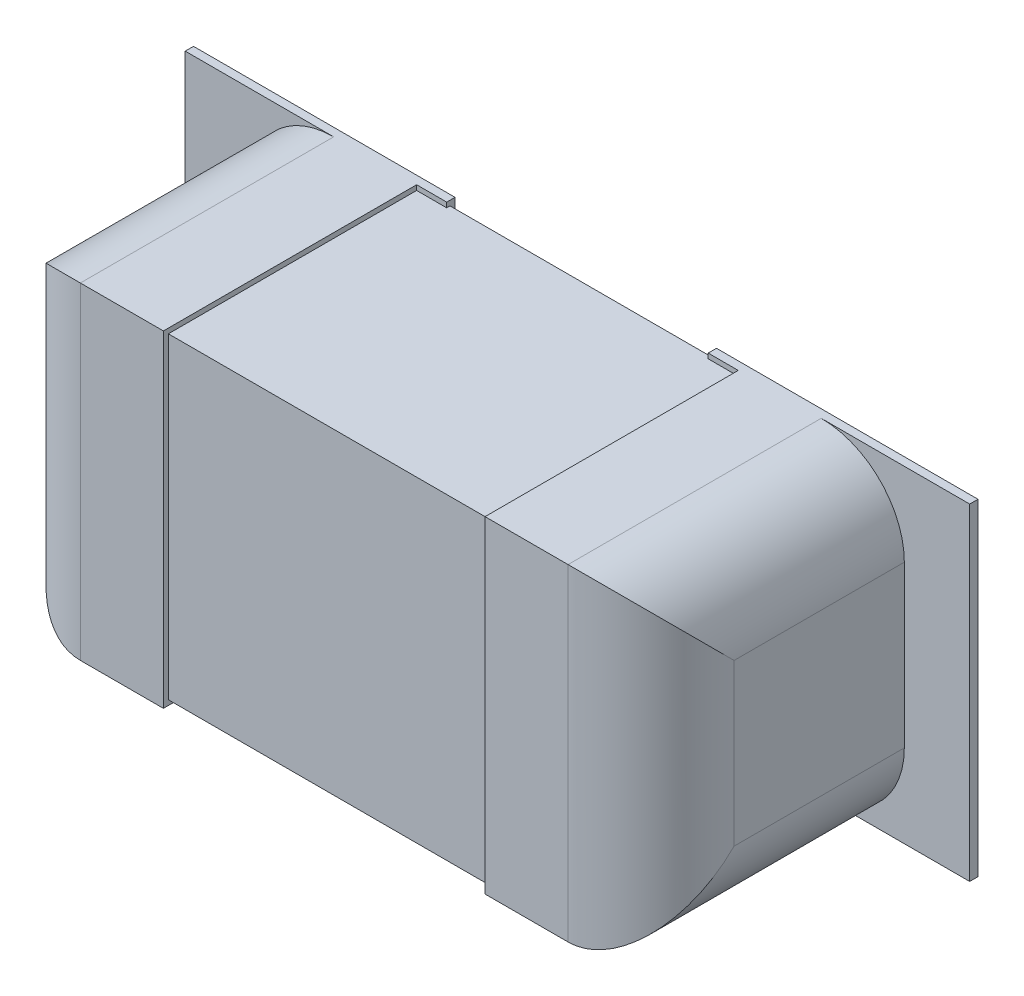
ISO-10303-21;
HEADER;
FILE_DESCRIPTION(('STEP AP214'),'2;1');
FILE_NAME('part.step','',(''),(''),'','','');
FILE_SCHEMA(('AUTOMOTIVE_DESIGN { 1 0 10303 214 1 1 1 1 }'));
ENDSEC;
DATA;
#1=APPLICATION_CONTEXT('core data for automotive mechanical design processes');
#2=APPLICATION_PROTOCOL_DEFINITION('international standard','automotive_design',2000,#1);
#3=PRODUCT_CONTEXT('',#1,'mechanical');
#4=PRODUCT('Part','Part','',(#3));
#5=PRODUCT_RELATED_PRODUCT_CATEGORY('part','',(#4));
#6=PRODUCT_DEFINITION_FORMATION('','',#4);
#7=PRODUCT_DEFINITION_CONTEXT('part definition',#1,'design');
#8=PRODUCT_DEFINITION('design','',#6,#7);
#9=PRODUCT_DEFINITION_SHAPE('','',#8);
#10=(LENGTH_UNIT() NAMED_UNIT(*) SI_UNIT(.MILLI.,.METRE.));
#11=(NAMED_UNIT(*) PLANE_ANGLE_UNIT() SI_UNIT($,.RADIAN.));
#12=(NAMED_UNIT(*) SI_UNIT($,.STERADIAN.) SOLID_ANGLE_UNIT());
#13=UNCERTAINTY_MEASURE_WITH_UNIT(LENGTH_MEASURE(1.E-05),#10,'distance_accuracy_value','');
#14=(GEOMETRIC_REPRESENTATION_CONTEXT(3) GLOBAL_UNCERTAINTY_ASSIGNED_CONTEXT((#13)) GLOBAL_UNIT_ASSIGNED_CONTEXT((#10,
#11,#12)) REPRESENTATION_CONTEXT('',''));
#15=CARTESIAN_POINT('',(0.,0.,0.));
#16=DIRECTION('',(0.,0.,1.));
#17=DIRECTION('',(1.,0.,0.));
#18=AXIS2_PLACEMENT_3D('',#15,#16,#17);
#19=CARTESIAN_POINT('',(0.500000000000032,-0.249999999999991,0.0762));
#20=DIRECTION('',(1.,0.,0.));
#21=DIRECTION('',(0.,0.,-1.));
#22=AXIS2_PLACEMENT_3D('',#19,#20,#21);
#23=PLANE('',#22);
#24=DIRECTION('',(0.,0.,-1.));
#25=VECTOR('',#24,1.);
#26=CARTESIAN_POINT('',(0.500000000000032,-0.122999999999991,0.478378306702738));
#27=LINE('',#26,#25);
#28=CARTESIAN_POINT('',(0.500000000000032,-0.122999999999991,0.0889));
#29=VERTEX_POINT('',#28);
#30=CARTESIAN_POINT('',(0.500000000000032,-0.122999999999991,0.34925));
#31=VERTEX_POINT('',#30);
#32=EDGE_CURVE('E337',#29,#31,#27,.F.);
#33=ORIENTED_EDGE('',*,*,#32,.F.);
#34=DIRECTION('',(0.,1.,0.));
#35=VECTOR('',#34,1.);
#36=CARTESIAN_POINT('',(0.500000000000032,0.,0.0889));
#37=LINE('',#36,#35);
#38=CARTESIAN_POINT('',(0.500000000000032,0.122999999999991,0.0889));
#39=VERTEX_POINT('',#38);
#40=EDGE_CURVE('E203',#39,#29,#37,.F.);
#41=ORIENTED_EDGE('',*,*,#40,.F.);
#42=DIRECTION('',(0.,0.,-1.));
#43=VECTOR('',#42,1.);
#44=CARTESIAN_POINT('',(0.500000000000032,0.122999999999991,0.478378306702738));
#45=LINE('',#44,#43);
#46=CARTESIAN_POINT('',(0.500000000000032,0.122999999999991,0.34925));
#47=VERTEX_POINT('',#46);
#48=EDGE_CURVE('E198',#47,#39,#45,.T.);
#49=ORIENTED_EDGE('',*,*,#48,.F.);
#50=DIRECTION('',(0.,1.,0.));
#51=VECTOR('',#50,1.);
#52=CARTESIAN_POINT('',(0.500000000000032,-0.252051106620578,0.34925));
#53=LINE('',#52,#51);
#54=EDGE_CURVE('E201',#31,#47,#53,.T.);
#55=ORIENTED_EDGE('',*,*,#54,.F.);
#56=EDGE_LOOP('',(#33,#41,#49,#55));
#57=FACE_BOUND('',#56,.T.);
#58=ADVANCED_FACE('F17',(#57),#23,.T.);
#59=CARTESIAN_POINT('',(-0.500000000000032,0.249999999999991,0.0762));
#60=DIRECTION('',(-1.,0.,0.));
#61=DIRECTION('',(0.,0.,1.));
#62=AXIS2_PLACEMENT_3D('',#59,#60,#61);
#63=PLANE('',#62);
#64=DIRECTION('',(0.,0.,-1.));
#65=VECTOR('',#64,1.);
#66=CARTESIAN_POINT('',(-0.500000000000032,0.122999999999991,0.478378306702738));
#67=LINE('',#66,#65);
#68=CARTESIAN_POINT('',(-0.500000000000032,0.122999999999991,0.0889));
#69=VERTEX_POINT('',#68);
#70=CARTESIAN_POINT('',(-0.500000000000032,0.122999999999991,0.34925));
#71=VERTEX_POINT('',#70);
#72=EDGE_CURVE('E322',#69,#71,#67,.F.);
#73=ORIENTED_EDGE('',*,*,#72,.F.);
#74=DIRECTION('',(0.,1.,0.));
#75=VECTOR('',#74,1.);
#76=CARTESIAN_POINT('',(-0.500000000000032,0.,0.0889));
#77=LINE('',#76,#75);
#78=CARTESIAN_POINT('',(-0.500000000000032,-0.122999999999991,0.0889));
#79=VERTEX_POINT('',#78);
#80=EDGE_CURVE('E326',#79,#69,#77,.T.);
#81=ORIENTED_EDGE('',*,*,#80,.F.);
#82=DIRECTION('',(0.,0.,-1.));
#83=VECTOR('',#82,1.);
#84=CARTESIAN_POINT('',(-0.500000000000032,-0.122999999999991,0.478378306702738));
#85=LINE('',#84,#83);
#86=CARTESIAN_POINT('',(-0.500000000000032,-0.122999999999991,0.34925));
#87=VERTEX_POINT('',#86);
#88=EDGE_CURVE('E351',#87,#79,#85,.T.);
#89=ORIENTED_EDGE('',*,*,#88,.F.);
#90=DIRECTION('',(0.,-1.,0.));
#91=VECTOR('',#90,1.);
#92=CARTESIAN_POINT('',(-0.500000000000032,0.252091420405508,0.34925));
#93=LINE('',#92,#91);
#94=EDGE_CURVE('E331',#71,#87,#93,.T.);
#95=ORIENTED_EDGE('',*,*,#94,.F.);
#96=EDGE_LOOP('',(#73,#81,#89,#95));
#97=FACE_BOUND('',#96,.T.);
#98=ADVANCED_FACE('F615',(#97),#63,.T.);
#99=CARTESIAN_POINT('',(0.373000000000032,0.122999999999991,0.478378306702738));
#100=DIRECTION('',(0.,0.,-1.));
#101=DIRECTION('',(-1.,0.,0.));
#102=AXIS2_PLACEMENT_3D('',#99,#100,#101);
#103=CYLINDRICAL_SURFACE('',#102,0.127);
#104=ORIENTED_EDGE('',*,*,#48,.T.);
#105=CARTESIAN_POINT('',(0.373000000000032,0.122999999999991,0.0889));
#106=DIRECTION('',(0.,0.,-1.));
#107=DIRECTION('',(-1.,0.,0.));
#108=AXIS2_PLACEMENT_3D('',#105,#106,#107);
#109=CIRCLE('',#108,0.127);
#110=CARTESIAN_POINT('',(0.372864268206423,0.249999999999991,0.0889000237809729));
#111=VERTEX_POINT('',#110);
#112=EDGE_CURVE('E220',#111,#39,#109,.T.);
#113=ORIENTED_EDGE('',*,*,#112,.F.);
#114=DIRECTION('',(-0.00035041123947052,0.,-0.99999993860598));
#115=VECTOR('',#114,1.);
#116=CARTESIAN_POINT('',(0.373000000000032,0.249999999999991,0.47625));
#117=LINE('',#116,#115);
#118=CARTESIAN_POINT('',(0.373000000000032,0.249999999999991,0.47625));
#119=VERTEX_POINT('',#118);
#120=EDGE_CURVE('E218',#119,#111,#117,.T.);
#121=ORIENTED_EDGE('',*,*,#120,.F.);
#122=CARTESIAN_POINT('',(0.373000000000032,0.122999999999991,0.34925));
#123=DIRECTION('',(0.,0.707106781186547,-0.707106781186547));
#124=DIRECTION('',(0.,0.707106781186547,0.707106781186547));
#125=AXIS2_PLACEMENT_3D('',#122,#123,#124);
#126=ELLIPSE('',#125,0.179605122421383,0.127);
#127=EDGE_CURVE('E20',#47,#119,#126,.F.);
#128=ORIENTED_EDGE('',*,*,#127,.F.);
#129=EDGE_LOOP('',(#104,#113,#121,#128));
#130=FACE_BOUND('',#129,.T.);
#131=ADVANCED_FACE('F217',(#130),#103,.T.);
#132=CARTESIAN_POINT('',(0.373000000000032,-0.252051106620578,0.34925));
#133=DIRECTION('',(0.,1.,0.));
#134=DIRECTION('',(0.,0.,1.));
#135=AXIS2_PLACEMENT_3D('',#132,#133,#134);
#136=CYLINDRICAL_SURFACE('',#135,0.127);
#137=CARTESIAN_POINT('',(0.373000000000032,-0.122999999999991,0.34925));
#138=DIRECTION('',(0.,-0.707106781186547,-0.707106781186547));
#139=DIRECTION('',(0.,0.707106781186547,-0.707106781186547));
#140=AXIS2_PLACEMENT_3D('',#137,#138,#139);
#141=ELLIPSE('',#140,0.179605122421383,0.127);
#142=CARTESIAN_POINT('',(0.373000000000032,-0.249999999999991,0.47625));
#143=VERTEX_POINT('',#142);
#144=EDGE_CURVE('E214',#31,#143,#141,.T.);
#145=ORIENTED_EDGE('',*,*,#144,.F.);
#146=ORIENTED_EDGE('',*,*,#54,.T.);
#147=ORIENTED_EDGE('',*,*,#127,.T.);
#148=DIRECTION('',(0.,1.,0.));
#149=VECTOR('',#148,1.);
#150=CARTESIAN_POINT('',(0.373000000000032,0.,0.47625));
#151=LINE('',#150,#149);
#152=EDGE_CURVE('E230',#143,#119,#151,.T.);
#153=ORIENTED_EDGE('',*,*,#152,.F.);
#154=EDGE_LOOP('',(#145,#146,#147,#153));
#155=FACE_BOUND('',#154,.T.);
#156=ADVANCED_FACE('F211',(#155),#136,.T.);
#157=CARTESIAN_POINT('',(0.5999988,-0.2500122,0.0762));
#158=DIRECTION('',(1.,0.,0.));
#159=DIRECTION('',(0.,0.,-1.));
#160=AXIS2_PLACEMENT_3D('',#157,#158,#159);
#161=PLANE('',#160);
#162=DIRECTION('',(0.,0.,-1.));
#163=VECTOR('',#162,1.);
#164=CARTESIAN_POINT('',(0.5999988,-0.249999999999991,0.0762));
#165=LINE('',#164,#163);
#166=CARTESIAN_POINT('',(0.5999988,-0.249999999999991,0.0762));
#167=VERTEX_POINT('',#166);
#168=CARTESIAN_POINT('',(0.5999988,-0.249999999999991,0.0889));
#169=VERTEX_POINT('',#168);
#170=EDGE_CURVE('E236',#167,#169,#165,.F.);
#171=ORIENTED_EDGE('',*,*,#170,.F.);
#172=DIRECTION('',(0.,1.,0.));
#173=VECTOR('',#172,1.);
#174=CARTESIAN_POINT('',(0.5999988,0.,0.0762));
#175=LINE('',#174,#173);
#176=CARTESIAN_POINT('',(0.5999988,0.249999999999991,0.0762));
#177=VERTEX_POINT('',#176);
#178=EDGE_CURVE('E335',#167,#177,#175,.T.);
#179=ORIENTED_EDGE('',*,*,#178,.T.);
#180=DIRECTION('',(0.,0.,1.));
#181=VECTOR('',#180,1.);
#182=CARTESIAN_POINT('',(0.5999988,0.249999999999991,0.0762));
#183=LINE('',#182,#181);
#184=CARTESIAN_POINT('',(0.5999988,0.249999999999991,0.0889));
#185=VERTEX_POINT('',#184);
#186=EDGE_CURVE('E314',#185,#177,#183,.F.);
#187=ORIENTED_EDGE('',*,*,#186,.F.);
#188=DIRECTION('',(0.,1.,0.));
#189=VECTOR('',#188,1.);
#190=CARTESIAN_POINT('',(0.5999988,0.,0.0889));
#191=LINE('',#190,#189);
#192=EDGE_CURVE('E215',#169,#185,#191,.T.);
#193=ORIENTED_EDGE('',*,*,#192,.F.);
#194=EDGE_LOOP('',(#171,#179,#187,#193));
#195=FACE_BOUND('',#194,.T.);
#196=ADVANCED_FACE('F347',(#195),#161,.T.);
#197=CARTESIAN_POINT('',(0.,0.,0.0889));
#198=DIRECTION('',(0.,0.,1.));
#199=DIRECTION('',(1.,0.,0.));
#200=AXIS2_PLACEMENT_3D('',#197,#198,#199);
#201=PLANE('',#200);
#202=ORIENTED_EDGE('',*,*,#112,.T.);
#203=ORIENTED_EDGE('',*,*,#40,.T.);
#204=CARTESIAN_POINT('',(0.373000000000032,-0.122999999999991,0.0889));
#205=DIRECTION('',(0.,0.,-1.));
#206=DIRECTION('',(-1.,0.,0.));
#207=AXIS2_PLACEMENT_3D('',#204,#205,#206);
#208=CIRCLE('',#207,0.127);
#209=CARTESIAN_POINT('',(0.372864268206423,-0.249999999999991,0.088900023780973));
#210=VERTEX_POINT('',#209);
#211=EDGE_CURVE('E332',#210,#29,#208,.F.);
#212=ORIENTED_EDGE('',*,*,#211,.F.);
#213=DIRECTION('',(1.,0.,0.));
#214=VECTOR('',#213,1.);
#215=CARTESIAN_POINT('',(-0.500000000000032,-0.249999999999991,0.0889));
#216=LINE('',#215,#214);
#217=EDGE_CURVE('E312',#169,#210,#216,.F.);
#218=ORIENTED_EDGE('',*,*,#217,.F.);
#219=ORIENTED_EDGE('',*,*,#192,.T.);
#220=DIRECTION('',(1.,0.,0.));
#221=VECTOR('',#220,1.);
#222=CARTESIAN_POINT('',(0.500000000000032,0.249999999999991,0.0889));
#223=LINE('',#222,#221);
#224=EDGE_CURVE('E225',#111,#185,#223,.T.);
#225=ORIENTED_EDGE('',*,*,#224,.F.);
#226=EDGE_LOOP('',(#202,#203,#212,#218,#219,#225));
#227=FACE_BOUND('',#226,.T.);
#228=ADVANCED_FACE('F341',(#227),#201,.T.);
#229=CARTESIAN_POINT('',(0.373000000000032,-0.122999999999991,0.478378306702738));
#230=DIRECTION('',(0.,0.,-1.));
#231=DIRECTION('',(-1.,0.,0.));
#232=AXIS2_PLACEMENT_3D('',#229,#230,#231);
#233=CYLINDRICAL_SURFACE('',#232,0.127);
#234=DIRECTION('',(0.00035041123947052,0.,0.99999993860598));
#235=VECTOR('',#234,1.);
#236=CARTESIAN_POINT('',(0.37286426819809,-0.249999999999991,0.0889));
#237=LINE('',#236,#235);
#238=EDGE_CURVE('E432',#210,#143,#237,.T.);
#239=ORIENTED_EDGE('',*,*,#238,.F.);
#240=ORIENTED_EDGE('',*,*,#211,.T.);
#241=ORIENTED_EDGE('',*,*,#32,.T.);
#242=ORIENTED_EDGE('',*,*,#144,.T.);
#243=EDGE_LOOP('',(#239,#240,#241,#242));
#244=FACE_BOUND('',#243,.T.);
#245=ADVANCED_FACE('F438',(#244),#233,.T.);
#246=CARTESIAN_POINT('',(0.,0.,0.0762));
#247=DIRECTION('',(0.,0.,1.));
#248=DIRECTION('',(1.,0.,0.));
#249=AXIS2_PLACEMENT_3D('',#246,#247,#248);
#250=PLANE('',#249);
#251=DIRECTION('',(1.,0.,0.));
#252=VECTOR('',#251,1.);
#253=CARTESIAN_POINT('',(-0.500000000000032,-0.249999999999991,0.0762));
#254=LINE('',#253,#252);
#255=CARTESIAN_POINT('',(0.1999996,-0.249999999999991,0.0762));
#256=VERTEX_POINT('',#255);
#257=EDGE_CURVE('E308',#256,#167,#254,.T.);
#258=ORIENTED_EDGE('',*,*,#257,.F.);
#259=DIRECTION('',(0.,1.,0.));
#260=VECTOR('',#259,1.);
#261=CARTESIAN_POINT('',(0.1999996,0.2500122,0.0762));
#262=LINE('',#261,#260);
#263=CARTESIAN_POINT('',(0.1999996,0.249999999999991,0.0762));
#264=VERTEX_POINT('',#263);
#265=EDGE_CURVE('E301',#264,#256,#262,.F.);
#266=ORIENTED_EDGE('',*,*,#265,.F.);
#267=DIRECTION('',(1.,0.,0.));
#268=VECTOR('',#267,1.);
#269=CARTESIAN_POINT('',(0.500000000000032,0.249999999999991,0.0762));
#270=LINE('',#269,#268);
#271=EDGE_CURVE('E244',#177,#264,#270,.F.);
#272=ORIENTED_EDGE('',*,*,#271,.F.);
#273=ORIENTED_EDGE('',*,*,#178,.F.);
#274=EDGE_LOOP('',(#258,#266,#272,#273));
#275=FACE_BOUND('',#274,.T.);
#276=ADVANCED_FACE('F354',(#275),#250,.F.);
#277=CARTESIAN_POINT('',(-0.373000000000032,-0.122999999999991,0.478378306702738));
#278=DIRECTION('',(0.,0.,-1.));
#279=DIRECTION('',(-1.,0.,0.));
#280=AXIS2_PLACEMENT_3D('',#277,#278,#279);
#281=CYLINDRICAL_SURFACE('',#280,0.127);
#282=ORIENTED_EDGE('',*,*,#88,.T.);
#283=CARTESIAN_POINT('',(-0.373000000000032,-0.122999999999991,0.0889));
#284=DIRECTION('',(0.,0.,-1.));
#285=DIRECTION('',(-1.,0.,0.));
#286=AXIS2_PLACEMENT_3D('',#283,#284,#285);
#287=CIRCLE('',#286,0.127);
#288=CARTESIAN_POINT('',(-0.372864268206423,-0.249999999999991,0.0889000237809729));
#289=VERTEX_POINT('',#288);
#290=EDGE_CURVE('E323',#289,#79,#287,.T.);
#291=ORIENTED_EDGE('',*,*,#290,.F.);
#292=DIRECTION('',(0.00035041123947052,0.,-0.99999993860598));
#293=VECTOR('',#292,1.);
#294=CARTESIAN_POINT('',(-0.373000000000032,-0.249999999999991,0.47625));
#295=LINE('',#294,#293);
#296=CARTESIAN_POINT('',(-0.373000000000032,-0.249999999999991,0.47625));
#297=VERTEX_POINT('',#296);
#298=EDGE_CURVE('E297',#297,#289,#295,.T.);
#299=ORIENTED_EDGE('',*,*,#298,.F.);
#300=CARTESIAN_POINT('',(-0.373000000000032,-0.122999999999991,0.34925));
#301=DIRECTION('',(0.,-0.707106781186547,-0.707106781186547));
#302=DIRECTION('',(0.,-0.707106781186547,0.707106781186547));
#303=AXIS2_PLACEMENT_3D('',#300,#301,#302);
#304=ELLIPSE('',#303,0.179605122421383,0.127);
#305=EDGE_CURVE('E329',#87,#297,#304,.F.);
#306=ORIENTED_EDGE('',*,*,#305,.F.);
#307=EDGE_LOOP('',(#282,#291,#299,#306));
#308=FACE_BOUND('',#307,.T.);
#309=ADVANCED_FACE('F611',(#308),#281,.T.);
#310=CARTESIAN_POINT('',(-0.373000000000032,0.252091420405508,0.34925));
#311=DIRECTION('',(0.,-1.,0.));
#312=DIRECTION('',(0.,0.,-1.));
#313=AXIS2_PLACEMENT_3D('',#310,#311,#312);
#314=CYLINDRICAL_SURFACE('',#313,0.127);
#315=ORIENTED_EDGE('',*,*,#305,.T.);
#316=DIRECTION('',(0.,1.,0.));
#317=VECTOR('',#316,1.);
#318=CARTESIAN_POINT('',(-0.373000000000032,0.,0.47625));
#319=LINE('',#318,#317);
#320=CARTESIAN_POINT('',(-0.373000000000032,0.249999999999991,0.47625));
#321=VERTEX_POINT('',#320);
#322=EDGE_CURVE('E286',#321,#297,#319,.F.);
#323=ORIENTED_EDGE('',*,*,#322,.F.);
#324=CARTESIAN_POINT('',(-0.373000000000032,0.122999999999991,0.34925));
#325=DIRECTION('',(0.,0.707106781186547,-0.707106781186547));
#326=DIRECTION('',(0.,-0.707106781186547,-0.707106781186547));
#327=AXIS2_PLACEMENT_3D('',#324,#325,#326);
#328=ELLIPSE('',#327,0.179605122421383,0.127);
#329=EDGE_CURVE('E320',#71,#321,#328,.T.);
#330=ORIENTED_EDGE('',*,*,#329,.F.);
#331=ORIENTED_EDGE('',*,*,#94,.T.);
#332=EDGE_LOOP('',(#315,#323,#330,#331));
#333=FACE_BOUND('',#332,.T.);
#334=ADVANCED_FACE('F606',(#333),#314,.T.);
#335=CARTESIAN_POINT('',(-0.5999988,0.2500122,0.0762));
#336=DIRECTION('',(-1.,0.,0.));
#337=DIRECTION('',(0.,0.,1.));
#338=AXIS2_PLACEMENT_3D('',#335,#336,#337);
#339=PLANE('',#338);
#340=DIRECTION('',(0.,0.,1.));
#341=VECTOR('',#340,1.);
#342=CARTESIAN_POINT('',(-0.5999988,0.249999999999991,0.0762));
#343=LINE('',#342,#341);
#344=CARTESIAN_POINT('',(-0.5999988,0.249999999999991,0.0762));
#345=VERTEX_POINT('',#344);
#346=CARTESIAN_POINT('',(-0.5999988,0.249999999999991,0.0889));
#347=VERTEX_POINT('',#346);
#348=EDGE_CURVE('E283',#345,#347,#343,.T.);
#349=ORIENTED_EDGE('',*,*,#348,.F.);
#350=DIRECTION('',(0.,1.,0.));
#351=VECTOR('',#350,1.);
#352=CARTESIAN_POINT('',(-0.5999988,0.,0.0762));
#353=LINE('',#352,#351);
#354=CARTESIAN_POINT('',(-0.5999988,-0.249999999999991,0.0762));
#355=VERTEX_POINT('',#354);
#356=EDGE_CURVE('E226',#345,#355,#353,.F.);
#357=ORIENTED_EDGE('',*,*,#356,.T.);
#358=DIRECTION('',(0.,0.,-1.));
#359=VECTOR('',#358,1.);
#360=CARTESIAN_POINT('',(-0.5999988,-0.249999999999991,0.0762));
#361=LINE('',#360,#359);
#362=CARTESIAN_POINT('',(-0.5999988,-0.249999999999991,0.0889));
#363=VERTEX_POINT('',#362);
#364=EDGE_CURVE('E292',#363,#355,#361,.T.);
#365=ORIENTED_EDGE('',*,*,#364,.F.);
#366=DIRECTION('',(0.,1.,0.));
#367=VECTOR('',#366,1.);
#368=CARTESIAN_POINT('',(-0.5999988,0.,0.0889));
#369=LINE('',#368,#367);
#370=EDGE_CURVE('E327',#347,#363,#369,.F.);
#371=ORIENTED_EDGE('',*,*,#370,.F.);
#372=EDGE_LOOP('',(#349,#357,#365,#371));
#373=FACE_BOUND('',#372,.T.);
#374=ADVANCED_FACE('F596',(#373),#339,.T.);
#375=CARTESIAN_POINT('',(0.,0.,0.0889));
#376=DIRECTION('',(0.,0.,1.));
#377=DIRECTION('',(1.,0.,0.));
#378=AXIS2_PLACEMENT_3D('',#375,#376,#377);
#379=PLANE('',#378);
#380=ORIENTED_EDGE('',*,*,#290,.T.);
#381=ORIENTED_EDGE('',*,*,#80,.T.);
#382=CARTESIAN_POINT('',(-0.373000000000032,0.122999999999991,0.0889));
#383=DIRECTION('',(0.,0.,-1.));
#384=DIRECTION('',(-1.,0.,0.));
#385=AXIS2_PLACEMENT_3D('',#382,#383,#384);
#386=CIRCLE('',#385,0.127);
#387=CARTESIAN_POINT('',(-0.372864268206423,0.249999999999991,0.088900023780973));
#388=VERTEX_POINT('',#387);
#389=EDGE_CURVE('E317',#388,#69,#386,.F.);
#390=ORIENTED_EDGE('',*,*,#389,.F.);
#391=DIRECTION('',(1.,0.,0.));
#392=VECTOR('',#391,1.);
#393=CARTESIAN_POINT('',(0.500000000000032,0.249999999999991,0.0889));
#394=LINE('',#393,#392);
#395=EDGE_CURVE('E285',#347,#388,#394,.T.);
#396=ORIENTED_EDGE('',*,*,#395,.F.);
#397=ORIENTED_EDGE('',*,*,#370,.T.);
#398=DIRECTION('',(1.,0.,0.));
#399=VECTOR('',#398,1.);
#400=CARTESIAN_POINT('',(-0.500000000000032,-0.249999999999991,0.0889));
#401=LINE('',#400,#399);
#402=EDGE_CURVE('E294',#289,#363,#401,.F.);
#403=ORIENTED_EDGE('',*,*,#402,.F.);
#404=EDGE_LOOP('',(#380,#381,#390,#396,#397,#403));
#405=FACE_BOUND('',#404,.T.);
#406=ADVANCED_FACE('F601',(#405),#379,.T.);
#407=CARTESIAN_POINT('',(-0.373000000000032,0.122999999999991,0.478378306702738));
#408=DIRECTION('',(0.,0.,-1.));
#409=DIRECTION('',(-1.,0.,0.));
#410=AXIS2_PLACEMENT_3D('',#407,#408,#409);
#411=CYLINDRICAL_SURFACE('',#410,0.127);
#412=DIRECTION('',(-0.00035041123947052,0.,0.99999993860598));
#413=VECTOR('',#412,1.);
#414=CARTESIAN_POINT('',(-0.37286426819809,0.249999999999991,0.0889));
#415=LINE('',#414,#413);
#416=EDGE_CURVE('E409',#388,#321,#415,.T.);
#417=ORIENTED_EDGE('',*,*,#416,.F.);
#418=ORIENTED_EDGE('',*,*,#389,.T.);
#419=ORIENTED_EDGE('',*,*,#72,.T.);
#420=ORIENTED_EDGE('',*,*,#329,.T.);
#421=EDGE_LOOP('',(#417,#418,#419,#420));
#422=FACE_BOUND('',#421,.T.);
#423=ADVANCED_FACE('F616',(#422),#411,.T.);
#424=CARTESIAN_POINT('',(0.,0.,0.0762));
#425=DIRECTION('',(0.,0.,1.));
#426=DIRECTION('',(1.,0.,0.));
#427=AXIS2_PLACEMENT_3D('',#424,#425,#426);
#428=PLANE('',#427);
#429=DIRECTION('',(1.,0.,0.));
#430=VECTOR('',#429,1.);
#431=CARTESIAN_POINT('',(0.500000000000032,0.249999999999991,0.0762));
#432=LINE('',#431,#430);
#433=CARTESIAN_POINT('',(-0.1999996,0.249999999999991,0.0762));
#434=VERTEX_POINT('',#433);
#435=EDGE_CURVE('E276',#434,#345,#432,.F.);
#436=ORIENTED_EDGE('',*,*,#435,.F.);
#437=DIRECTION('',(0.,1.,0.));
#438=VECTOR('',#437,1.);
#439=CARTESIAN_POINT('',(-0.1999996,-0.2500122,0.0762));
#440=LINE('',#439,#438);
#441=CARTESIAN_POINT('',(-0.1999996,-0.249999999999991,0.0762));
#442=VERTEX_POINT('',#441);
#443=EDGE_CURVE('E402',#442,#434,#440,.T.);
#444=ORIENTED_EDGE('',*,*,#443,.F.);
#445=DIRECTION('',(1.,0.,0.));
#446=VECTOR('',#445,1.);
#447=CARTESIAN_POINT('',(-0.500000000000032,-0.249999999999991,0.0762));
#448=LINE('',#447,#446);
#449=EDGE_CURVE('E290',#355,#442,#448,.T.);
#450=ORIENTED_EDGE('',*,*,#449,.F.);
#451=ORIENTED_EDGE('',*,*,#356,.F.);
#452=EDGE_LOOP('',(#436,#444,#450,#451));
#453=FACE_BOUND('',#452,.T.);
#454=ADVANCED_FACE('F592',(#453),#428,.F.);
#455=CARTESIAN_POINT('',(0.,0.,0.0889));
#456=DIRECTION('',(0.,0.,1.));
#457=DIRECTION('',(1.,0.,0.));
#458=AXIS2_PLACEMENT_3D('',#455,#456,#457);
#459=PLANE('',#458);
#460=DIRECTION('',(1.,0.,0.));
#461=VECTOR('',#460,1.);
#462=CARTESIAN_POINT('',(-0.246000000000007,0.242379999999991,0.0889));
#463=LINE('',#462,#461);
#464=CARTESIAN_POINT('',(0.1999996,0.242379999999991,0.0889));
#465=VERTEX_POINT('',#464);
#466=CARTESIAN_POINT('',(0.246000000000007,0.242379999999991,0.0889));
#467=VERTEX_POINT('',#466);
#468=EDGE_CURVE('E271',#465,#467,#463,.T.);
#469=ORIENTED_EDGE('',*,*,#468,.T.);
#470=DIRECTION('',(0.,1.,0.));
#471=VECTOR('',#470,1.);
#472=CARTESIAN_POINT('',(0.246000000000007,-0.249999999999991,0.0889));
#473=LINE('',#472,#471);
#474=CARTESIAN_POINT('',(0.246000000000007,0.250002033333325,0.0889));
#475=VERTEX_POINT('',#474);
#476=EDGE_CURVE('E256',#467,#475,#473,.T.);
#477=ORIENTED_EDGE('',*,*,#476,.T.);
#478=DIRECTION('',(1.,0.,0.));
#479=VECTOR('',#478,1.);
#480=CARTESIAN_POINT('',(0.500000000000032,0.249999999999991,0.0889));
#481=LINE('',#480,#479);
#482=CARTESIAN_POINT('',(0.1999996,0.249999999999991,0.0889));
#483=VERTEX_POINT('',#482);
#484=EDGE_CURVE('E242',#483,#475,#481,.T.);
#485=ORIENTED_EDGE('',*,*,#484,.F.);
#486=DIRECTION('',(0.,1.,0.));
#487=VECTOR('',#486,1.);
#488=CARTESIAN_POINT('',(0.1999996,0.2500122,0.0889));
#489=LINE('',#488,#487);
#490=EDGE_CURVE('E305',#465,#483,#489,.T.);
#491=ORIENTED_EDGE('',*,*,#490,.F.);
#492=EDGE_LOOP('',(#469,#477,#485,#491));
#493=FACE_BOUND('',#492,.T.);
#494=ADVANCED_FACE('F366',(#493),#459,.T.);
#495=CARTESIAN_POINT('',(0.500000000000032,0.249999999999991,0.0762));
#496=DIRECTION('',(0.,1.,0.));
#497=DIRECTION('',(0.,0.,1.));
#498=AXIS2_PLACEMENT_3D('',#495,#496,#497);
#499=PLANE('',#498);
#500=ORIENTED_EDGE('',*,*,#484,.T.);
#501=DIRECTION('',(0.,0.,-1.));
#502=VECTOR('',#501,1.);
#503=CARTESIAN_POINT('',(0.246000000000007,0.25000406666666,0.08382));
#504=LINE('',#503,#502);
#505=CARTESIAN_POINT('',(0.246000000000007,0.249999999999991,0.47625));
#506=VERTEX_POINT('',#505);
#507=EDGE_CURVE('E241',#475,#506,#504,.F.);
#508=ORIENTED_EDGE('',*,*,#507,.T.);
#509=DIRECTION('',(1.,0.,0.));
#510=VECTOR('',#509,1.);
#511=CARTESIAN_POINT('',(0.,0.249999999999991,0.47625));
#512=LINE('',#511,#510);
#513=EDGE_CURVE('E233',#119,#506,#512,.F.);
#514=ORIENTED_EDGE('',*,*,#513,.F.);
#515=ORIENTED_EDGE('',*,*,#120,.T.);
#516=ORIENTED_EDGE('',*,*,#224,.T.);
#517=ORIENTED_EDGE('',*,*,#186,.T.);
#518=ORIENTED_EDGE('',*,*,#271,.T.);
#519=DIRECTION('',(0.,0.,-1.));
#520=VECTOR('',#519,1.);
#521=CARTESIAN_POINT('',(0.1999996,0.249999999999991,0.0762));
#522=LINE('',#521,#520);
#523=EDGE_CURVE('E302',#483,#264,#522,.T.);
#524=ORIENTED_EDGE('',*,*,#523,.F.);
#525=EDGE_LOOP('',(#500,#508,#514,#515,#516,#517,#518,#524));
#526=FACE_BOUND('',#525,.T.);
#527=ADVANCED_FACE('F239',(#526),#499,.T.);
#528=CARTESIAN_POINT('',(0.,0.,0.47625));
#529=DIRECTION('',(0.,0.,1.));
#530=DIRECTION('',(1.,0.,0.));
#531=AXIS2_PLACEMENT_3D('',#528,#529,#530);
#532=PLANE('',#531);
#533=DIRECTION('',(1.,0.,0.));
#534=VECTOR('',#533,1.);
#535=CARTESIAN_POINT('',(-0.500000000000032,-0.249999999999991,0.47625));
#536=LINE('',#535,#534);
#537=CARTESIAN_POINT('',(0.246000000000007,-0.249999999999991,0.47625));
#538=VERTEX_POINT('',#537);
#539=EDGE_CURVE('E235',#143,#538,#536,.F.);
#540=ORIENTED_EDGE('',*,*,#539,.F.);
#541=ORIENTED_EDGE('',*,*,#152,.T.);
#542=ORIENTED_EDGE('',*,*,#513,.T.);
#543=DIRECTION('',(0.,1.,0.));
#544=VECTOR('',#543,1.);
#545=CARTESIAN_POINT('',(0.246000000000007,-0.249999999999991,0.47625));
#546=LINE('',#545,#544);
#547=EDGE_CURVE('E250',#506,#538,#546,.F.);
#548=ORIENTED_EDGE('',*,*,#547,.T.);
#549=EDGE_LOOP('',(#540,#541,#542,#548));
#550=FACE_BOUND('',#549,.T.);
#551=ADVANCED_FACE('F231',(#550),#532,.T.);
#552=CARTESIAN_POINT('',(-0.500000000000032,-0.249999999999991,0.0762));
#553=DIRECTION('',(0.,-1.,0.));
#554=DIRECTION('',(0.,0.,-1.));
#555=AXIS2_PLACEMENT_3D('',#552,#553,#554);
#556=PLANE('',#555);
#557=DIRECTION('',(0.,0.,1.));
#558=VECTOR('',#557,1.);
#559=CARTESIAN_POINT('',(0.1999996,-0.249999999999991,0.0762));
#560=LINE('',#559,#558);
#561=CARTESIAN_POINT('',(0.1999996,-0.249999999999991,0.0889));
#562=VERTEX_POINT('',#561);
#563=EDGE_CURVE('E298',#256,#562,#560,.T.);
#564=ORIENTED_EDGE('',*,*,#563,.F.);
#565=ORIENTED_EDGE('',*,*,#257,.T.);
#566=ORIENTED_EDGE('',*,*,#170,.T.);
#567=ORIENTED_EDGE('',*,*,#217,.T.);
#568=ORIENTED_EDGE('',*,*,#238,.T.);
#569=ORIENTED_EDGE('',*,*,#539,.T.);
#570=DIRECTION('',(0.,0.,-1.));
#571=VECTOR('',#570,1.);
#572=CARTESIAN_POINT('',(0.246000000000007,-0.249999999999991,0.08382));
#573=LINE('',#572,#571);
#574=CARTESIAN_POINT('',(0.246000000000007,-0.249999999999991,0.0889));
#575=VERTEX_POINT('',#574);
#576=EDGE_CURVE('E252',#538,#575,#573,.T.);
#577=ORIENTED_EDGE('',*,*,#576,.T.);
#578=DIRECTION('',(1.,0.,0.));
#579=VECTOR('',#578,1.);
#580=CARTESIAN_POINT('',(0.,-0.249999999999991,0.0889));
#581=LINE('',#580,#579);
#582=EDGE_CURVE('E306',#562,#575,#581,.T.);
#583=ORIENTED_EDGE('',*,*,#582,.F.);
#584=EDGE_LOOP('',(#564,#565,#566,#567,#568,#569,#577,#583));
#585=FACE_BOUND('',#584,.T.);
#586=ADVANCED_FACE('F440',(#585),#556,.T.);
#587=CARTESIAN_POINT('',(0.,0.,0.0889));
#588=DIRECTION('',(0.,0.,1.));
#589=DIRECTION('',(1.,0.,0.));
#590=AXIS2_PLACEMENT_3D('',#587,#588,#589);
#591=PLANE('',#590);
#592=DIRECTION('',(0.,1.,0.));
#593=VECTOR('',#592,1.);
#594=CARTESIAN_POINT('',(0.1999996,0.2500122,0.0889));
#595=LINE('',#594,#593);
#596=CARTESIAN_POINT('',(0.1999996,-0.242379999999991,0.0889));
#597=VERTEX_POINT('',#596);
#598=EDGE_CURVE('E300',#562,#597,#595,.T.);
#599=ORIENTED_EDGE('',*,*,#598,.F.);
#600=ORIENTED_EDGE('',*,*,#582,.T.);
#601=DIRECTION('',(0.,1.,0.));
#602=VECTOR('',#601,1.);
#603=CARTESIAN_POINT('',(0.246000000000007,0.,0.0889));
#604=LINE('',#603,#602);
#605=CARTESIAN_POINT('',(0.246000000000007,-0.242379999999991,0.0889));
#606=VERTEX_POINT('',#605);
#607=EDGE_CURVE('E269',#575,#606,#604,.T.);
#608=ORIENTED_EDGE('',*,*,#607,.T.);
#609=DIRECTION('',(1.,0.,0.));
#610=VECTOR('',#609,1.);
#611=CARTESIAN_POINT('',(-0.246000000000007,-0.242379999999991,0.0889));
#612=LINE('',#611,#610);
#613=EDGE_CURVE('E386',#606,#597,#612,.F.);
#614=ORIENTED_EDGE('',*,*,#613,.T.);
#615=EDGE_LOOP('',(#599,#600,#608,#614));
#616=FACE_BOUND('',#615,.T.);
#617=ADVANCED_FACE('F452',(#616),#591,.T.);
#618=CARTESIAN_POINT('',(0.1999996,0.2500122,0.0762));
#619=DIRECTION('',(-1.,0.,0.));
#620=DIRECTION('',(0.,0.,1.));
#621=AXIS2_PLACEMENT_3D('',#618,#619,#620);
#622=PLANE('',#621);
#623=DIRECTION('',(0.,0.,1.));
#624=VECTOR('',#623,1.);
#625=CARTESIAN_POINT('',(0.1999996,-0.242379999999991,0.47625));
#626=LINE('',#625,#624);
#627=CARTESIAN_POINT('',(0.1999996,-0.242379999999991,0.08382));
#628=VERTEX_POINT('',#627);
#629=EDGE_CURVE('E389',#597,#628,#626,.F.);
#630=ORIENTED_EDGE('',*,*,#629,.T.);
#631=DIRECTION('',(0.,1.,0.));
#632=VECTOR('',#631,1.);
#633=CARTESIAN_POINT('',(0.1999996,-0.249999999999991,0.08382));
#634=LINE('',#633,#632);
#635=CARTESIAN_POINT('',(0.1999996,0.242379999999991,0.08382));
#636=VERTEX_POINT('',#635);
#637=EDGE_CURVE('E405',#628,#636,#634,.T.);
#638=ORIENTED_EDGE('',*,*,#637,.T.);
#639=DIRECTION('',(0.,0.,-1.));
#640=VECTOR('',#639,1.);
#641=CARTESIAN_POINT('',(0.1999996,0.242379999999991,0.0762));
#642=LINE('',#641,#640);
#643=EDGE_CURVE('E362',#636,#465,#642,.F.);
#644=ORIENTED_EDGE('',*,*,#643,.T.);
#645=ORIENTED_EDGE('',*,*,#490,.T.);
#646=ORIENTED_EDGE('',*,*,#523,.T.);
#647=ORIENTED_EDGE('',*,*,#265,.T.);
#648=ORIENTED_EDGE('',*,*,#563,.T.);
#649=ORIENTED_EDGE('',*,*,#598,.T.);
#650=EDGE_LOOP('',(#630,#638,#644,#645,#646,#647,#648,#649));
#651=FACE_BOUND('',#650,.T.);
#652=ADVANCED_FACE('F358',(#651),#622,.T.);
#653=CARTESIAN_POINT('',(-0.246000000000007,-0.249999999999991,0.08382));
#654=DIRECTION('',(0.,0.,1.));
#655=DIRECTION('',(1.,0.,0.));
#656=AXIS2_PLACEMENT_3D('',#653,#654,#655);
#657=PLANE('',#656);
#658=DIRECTION('',(0.,1.,0.));
#659=VECTOR('',#658,1.);
#660=CARTESIAN_POINT('',(-0.1999996,-0.2500122,0.08382));
#661=LINE('',#660,#659);
#662=CARTESIAN_POINT('',(-0.1999996,0.242379999999991,0.08382));
#663=VERTEX_POINT('',#662);
#664=CARTESIAN_POINT('',(-0.1999996,-0.242379999999991,0.08382));
#665=VERTEX_POINT('',#664);
#666=EDGE_CURVE('E404',#663,#665,#661,.F.);
#667=ORIENTED_EDGE('',*,*,#666,.F.);
#668=DIRECTION('',(1.,0.,0.));
#669=VECTOR('',#668,1.);
#670=CARTESIAN_POINT('',(-0.246000000000007,0.242379999999991,0.08382));
#671=LINE('',#670,#669);
#672=EDGE_CURVE('E397',#663,#636,#671,.T.);
#673=ORIENTED_EDGE('',*,*,#672,.T.);
#674=ORIENTED_EDGE('',*,*,#637,.F.);
#675=DIRECTION('',(1.,0.,0.));
#676=VECTOR('',#675,1.);
#677=CARTESIAN_POINT('',(-0.246000000000007,-0.242379999999991,0.08382));
#678=LINE('',#677,#676);
#679=EDGE_CURVE('E450',#628,#665,#678,.F.);
#680=ORIENTED_EDGE('',*,*,#679,.T.);
#681=EDGE_LOOP('',(#667,#673,#674,#680));
#682=FACE_BOUND('',#681,.T.);
#683=ADVANCED_FACE('F460',(#682),#657,.F.);
#684=CARTESIAN_POINT('',(-0.1999996,-0.2500122,0.0762));
#685=DIRECTION('',(1.,0.,0.));
#686=DIRECTION('',(0.,0.,-1.));
#687=AXIS2_PLACEMENT_3D('',#684,#685,#686);
#688=PLANE('',#687);
#689=DIRECTION('',(0.,0.,-1.));
#690=VECTOR('',#689,1.);
#691=CARTESIAN_POINT('',(-0.1999996,0.242379999999991,0.0762));
#692=LINE('',#691,#690);
#693=CARTESIAN_POINT('',(-0.1999996,0.242379999999991,0.0889));
#694=VERTEX_POINT('',#693);
#695=EDGE_CURVE('E394',#694,#663,#692,.T.);
#696=ORIENTED_EDGE('',*,*,#695,.T.);
#697=ORIENTED_EDGE('',*,*,#666,.T.);
#698=DIRECTION('',(0.,0.,1.));
#699=VECTOR('',#698,1.);
#700=CARTESIAN_POINT('',(-0.1999996,-0.242379999999991,0.47625));
#701=LINE('',#700,#699);
#702=CARTESIAN_POINT('',(-0.1999996,-0.242379999999991,0.0889));
#703=VERTEX_POINT('',#702);
#704=EDGE_CURVE('E551',#665,#703,#701,.T.);
#705=ORIENTED_EDGE('',*,*,#704,.T.);
#706=DIRECTION('',(0.,1.,0.));
#707=VECTOR('',#706,1.);
#708=CARTESIAN_POINT('',(-0.1999996,0.,0.0889));
#709=LINE('',#708,#707);
#710=CARTESIAN_POINT('',(-0.1999996,-0.249999999999991,0.0889));
#711=VERTEX_POINT('',#710);
#712=EDGE_CURVE('E417',#711,#703,#709,.T.);
#713=ORIENTED_EDGE('',*,*,#712,.F.);
#714=DIRECTION('',(0.,0.,-1.));
#715=VECTOR('',#714,1.);
#716=CARTESIAN_POINT('',(-0.1999996,-0.249999999999991,0.0762));
#717=LINE('',#716,#715);
#718=EDGE_CURVE('E287',#442,#711,#717,.F.);
#719=ORIENTED_EDGE('',*,*,#718,.F.);
#720=ORIENTED_EDGE('',*,*,#443,.T.);
#721=DIRECTION('',(0.,0.,1.));
#722=VECTOR('',#721,1.);
#723=CARTESIAN_POINT('',(-0.1999996,0.249999999999991,0.0762));
#724=LINE('',#723,#722);
#725=CARTESIAN_POINT('',(-0.1999996,0.249999999999991,0.0889));
#726=VERTEX_POINT('',#725);
#727=EDGE_CURVE('E279',#726,#434,#724,.F.);
#728=ORIENTED_EDGE('',*,*,#727,.F.);
#729=DIRECTION('',(0.,1.,0.));
#730=VECTOR('',#729,1.);
#731=CARTESIAN_POINT('',(-0.1999996,0.,0.0889));
#732=LINE('',#731,#730);
#733=EDGE_CURVE('E275',#694,#726,#732,.T.);
#734=ORIENTED_EDGE('',*,*,#733,.F.);
#735=EDGE_LOOP('',(#696,#697,#705,#713,#719,#720,#728,#734));
#736=FACE_BOUND('',#735,.T.);
#737=ADVANCED_FACE('F501',(#736),#688,.T.);
#738=CARTESIAN_POINT('',(0.,0.,0.0889));
#739=DIRECTION('',(0.,0.,1.));
#740=DIRECTION('',(1.,0.,0.));
#741=AXIS2_PLACEMENT_3D('',#738,#739,#740);
#742=PLANE('',#741);
#743=DIRECTION('',(1.,0.,0.));
#744=VECTOR('',#743,1.);
#745=CARTESIAN_POINT('',(-0.246000000000007,-0.242379999999991,0.0889));
#746=LINE('',#745,#744);
#747=CARTESIAN_POINT('',(-0.246000000000007,-0.242379999999991,0.0889));
#748=VERTEX_POINT('',#747);
#749=EDGE_CURVE('E377',#703,#748,#746,.F.);
#750=ORIENTED_EDGE('',*,*,#749,.T.);
#751=DIRECTION('',(0.,1.,0.));
#752=VECTOR('',#751,1.);
#753=CARTESIAN_POINT('',(-0.246000000000007,-0.249999999999991,0.0889));
#754=LINE('',#753,#752);
#755=CARTESIAN_POINT('',(-0.246000000000007,-0.250002711111104,0.0889));
#756=VERTEX_POINT('',#755);
#757=EDGE_CURVE('E543',#748,#756,#754,.F.);
#758=ORIENTED_EDGE('',*,*,#757,.T.);
#759=DIRECTION('',(1.,0.,0.));
#760=VECTOR('',#759,1.);
#761=CARTESIAN_POINT('',(-0.500000000000032,-0.249999999999991,0.0889));
#762=LINE('',#761,#760);
#763=EDGE_CURVE('E289',#711,#756,#762,.F.);
#764=ORIENTED_EDGE('',*,*,#763,.F.);
#765=ORIENTED_EDGE('',*,*,#712,.T.);
#766=EDGE_LOOP('',(#750,#758,#764,#765));
#767=FACE_BOUND('',#766,.T.);
#768=ADVANCED_FACE('F497',(#767),#742,.T.);
#769=CARTESIAN_POINT('',(-0.500000000000032,-0.249999999999991,0.0762));
#770=DIRECTION('',(0.,-1.,0.));
#771=DIRECTION('',(0.,0.,-1.));
#772=AXIS2_PLACEMENT_3D('',#769,#770,#771);
#773=PLANE('',#772);
#774=ORIENTED_EDGE('',*,*,#763,.T.);
#775=DIRECTION('',(0.,0.,1.));
#776=VECTOR('',#775,1.);
#777=CARTESIAN_POINT('',(-0.246000000000007,-0.25000406666666,0.0762));
#778=LINE('',#777,#776);
#779=CARTESIAN_POINT('',(-0.246000000000007,-0.250002711111104,0.47625));
#780=VERTEX_POINT('',#779);
#781=EDGE_CURVE('E535',#756,#780,#778,.T.);
#782=ORIENTED_EDGE('',*,*,#781,.T.);
#783=DIRECTION('',(1.,0.,0.));
#784=VECTOR('',#783,1.);
#785=CARTESIAN_POINT('',(0.,-0.249999999999991,0.47625));
#786=LINE('',#785,#784);
#787=EDGE_CURVE('E408',#297,#780,#786,.T.);
#788=ORIENTED_EDGE('',*,*,#787,.F.);
#789=ORIENTED_EDGE('',*,*,#298,.T.);
#790=ORIENTED_EDGE('',*,*,#402,.T.);
#791=ORIENTED_EDGE('',*,*,#364,.T.);
#792=ORIENTED_EDGE('',*,*,#449,.T.);
#793=ORIENTED_EDGE('',*,*,#718,.T.);
#794=EDGE_LOOP('',(#774,#782,#788,#789,#790,#791,#792,#793));
#795=FACE_BOUND('',#794,.T.);
#796=ADVANCED_FACE('F493',(#795),#773,.T.);
#797=CARTESIAN_POINT('',(0.,0.,0.47625));
#798=DIRECTION('',(0.,0.,1.));
#799=DIRECTION('',(1.,0.,0.));
#800=AXIS2_PLACEMENT_3D('',#797,#798,#799);
#801=PLANE('',#800);
#802=DIRECTION('',(1.,0.,0.));
#803=VECTOR('',#802,1.);
#804=CARTESIAN_POINT('',(0.500000000000032,0.249999999999991,0.47625));
#805=LINE('',#804,#803);
#806=CARTESIAN_POINT('',(-0.246000000000007,0.249999999999991,0.47625));
#807=VERTEX_POINT('',#806);
#808=EDGE_CURVE('E282',#321,#807,#805,.T.);
#809=ORIENTED_EDGE('',*,*,#808,.F.);
#810=ORIENTED_EDGE('',*,*,#322,.T.);
#811=ORIENTED_EDGE('',*,*,#787,.T.);
#812=DIRECTION('',(0.,1.,0.));
#813=VECTOR('',#812,1.);
#814=CARTESIAN_POINT('',(-0.246000000000007,-0.249999999999991,0.47625));
#815=LINE('',#814,#813);
#816=EDGE_CURVE('E532',#780,#807,#815,.T.);
#817=ORIENTED_EDGE('',*,*,#816,.T.);
#818=EDGE_LOOP('',(#809,#810,#811,#817));
#819=FACE_BOUND('',#818,.T.);
#820=ADVANCED_FACE('F489',(#819),#801,.T.);
#821=CARTESIAN_POINT('',(0.500000000000032,0.249999999999991,0.0762));
#822=DIRECTION('',(0.,1.,0.));
#823=DIRECTION('',(0.,0.,1.));
#824=AXIS2_PLACEMENT_3D('',#821,#822,#823);
#825=PLANE('',#824);
#826=ORIENTED_EDGE('',*,*,#727,.T.);
#827=ORIENTED_EDGE('',*,*,#435,.T.);
#828=ORIENTED_EDGE('',*,*,#348,.T.);
#829=ORIENTED_EDGE('',*,*,#395,.T.);
#830=ORIENTED_EDGE('',*,*,#416,.T.);
#831=ORIENTED_EDGE('',*,*,#808,.T.);
#832=DIRECTION('',(0.,0.,1.));
#833=VECTOR('',#832,1.);
#834=CARTESIAN_POINT('',(-0.246000000000007,0.249999999999991,0.0762));
#835=LINE('',#834,#833);
#836=CARTESIAN_POINT('',(-0.246000000000007,0.249999999999991,0.0889));
#837=VERTEX_POINT('',#836);
#838=EDGE_CURVE('E268',#807,#837,#835,.F.);
#839=ORIENTED_EDGE('',*,*,#838,.T.);
#840=DIRECTION('',(-1.,0.,0.));
#841=VECTOR('',#840,1.);
#842=CARTESIAN_POINT('',(0.,0.249999999999991,0.0889));
#843=LINE('',#842,#841);
#844=EDGE_CURVE('E272',#726,#837,#843,.T.);
#845=ORIENTED_EDGE('',*,*,#844,.F.);
#846=EDGE_LOOP('',(#826,#827,#828,#829,#830,#831,#839,#845));
#847=FACE_BOUND('',#846,.T.);
#848=ADVANCED_FACE('F485',(#847),#825,.T.);
#849=CARTESIAN_POINT('',(0.,0.,0.0889));
#850=DIRECTION('',(0.,0.,1.));
#851=DIRECTION('',(1.,0.,0.));
#852=AXIS2_PLACEMENT_3D('',#849,#850,#851);
#853=PLANE('',#852);
#854=ORIENTED_EDGE('',*,*,#733,.T.);
#855=ORIENTED_EDGE('',*,*,#844,.T.);
#856=DIRECTION('',(0.,1.,0.));
#857=VECTOR('',#856,1.);
#858=CARTESIAN_POINT('',(-0.246000000000007,0.,0.0889));
#859=LINE('',#858,#857);
#860=CARTESIAN_POINT('',(-0.246000000000007,0.242379999999991,0.0889));
#861=VERTEX_POINT('',#860);
#862=EDGE_CURVE('E264',#837,#861,#859,.F.);
#863=ORIENTED_EDGE('',*,*,#862,.T.);
#864=DIRECTION('',(1.,0.,0.));
#865=VECTOR('',#864,1.);
#866=CARTESIAN_POINT('',(-0.246000000000007,0.242379999999991,0.0889));
#867=LINE('',#866,#865);
#868=EDGE_CURVE('E274',#861,#694,#867,.T.);
#869=ORIENTED_EDGE('',*,*,#868,.T.);
#870=EDGE_LOOP('',(#854,#855,#863,#869));
#871=FACE_BOUND('',#870,.T.);
#872=ADVANCED_FACE('F481',(#871),#853,.T.);
#873=CARTESIAN_POINT('',(-0.246000000000007,0.242379999999991,0.0762));
#874=DIRECTION('',(0.,-1.,0.));
#875=DIRECTION('',(0.,0.,-1.));
#876=AXIS2_PLACEMENT_3D('',#873,#874,#875);
#877=PLANE('',#876);
#878=DIRECTION('',(-1.,0.,0.));
#879=VECTOR('',#878,1.);
#880=CARTESIAN_POINT('',(-0.246000000000007,0.242379999999991,0.46863));
#881=LINE('',#880,#879);
#882=CARTESIAN_POINT('',(-0.246000000000007,0.242379999999991,0.46863));
#883=VERTEX_POINT('',#882);
#884=CARTESIAN_POINT('',(0.246000000000007,0.242379999999991,0.46863));
#885=VERTEX_POINT('',#884);
#886=EDGE_CURVE('E557',#883,#885,#881,.F.);
#887=ORIENTED_EDGE('',*,*,#886,.T.);
#888=DIRECTION('',(0.,0.,-1.));
#889=VECTOR('',#888,1.);
#890=CARTESIAN_POINT('',(0.246000000000007,0.242379999999991,0.08382));
#891=LINE('',#890,#889);
#892=EDGE_CURVE('E261',#885,#467,#891,.T.);
#893=ORIENTED_EDGE('',*,*,#892,.T.);
#894=ORIENTED_EDGE('',*,*,#468,.F.);
#895=ORIENTED_EDGE('',*,*,#643,.F.);
#896=ORIENTED_EDGE('',*,*,#672,.F.);
#897=ORIENTED_EDGE('',*,*,#695,.F.);
#898=ORIENTED_EDGE('',*,*,#868,.F.);
#899=DIRECTION('',(0.,0.,1.));
#900=VECTOR('',#899,1.);
#901=CARTESIAN_POINT('',(-0.246000000000007,0.242379999999991,0.0762));
#902=LINE('',#901,#900);
#903=EDGE_CURVE('E267',#861,#883,#902,.T.);
#904=ORIENTED_EDGE('',*,*,#903,.T.);
#905=EDGE_LOOP('',(#887,#893,#894,#895,#896,#897,#898,#904));
#906=FACE_BOUND('',#905,.T.);
#907=ADVANCED_FACE('F478',(#906),#877,.F.);
#908=CARTESIAN_POINT('',(0.246000000000007,-0.249999999999991,0.08382));
#909=DIRECTION('',(1.,0.,0.));
#910=DIRECTION('',(0.,0.,-1.));
#911=AXIS2_PLACEMENT_3D('',#908,#909,#910);
#912=PLANE('',#911);
#913=ORIENTED_EDGE('',*,*,#547,.F.);
#914=ORIENTED_EDGE('',*,*,#507,.F.);
#915=ORIENTED_EDGE('',*,*,#476,.F.);
#916=ORIENTED_EDGE('',*,*,#892,.F.);
#917=DIRECTION('',(0.,1.,0.));
#918=VECTOR('',#917,1.);
#919=CARTESIAN_POINT('',(0.246000000000007,0.249999999999991,0.46863));
#920=LINE('',#919,#918);
#921=CARTESIAN_POINT('',(0.246000000000007,-0.242379999999991,0.46863));
#922=VERTEX_POINT('',#921);
#923=EDGE_CURVE('E584',#885,#922,#920,.F.);
#924=ORIENTED_EDGE('',*,*,#923,.T.);
#925=DIRECTION('',(0.,0.,1.));
#926=VECTOR('',#925,1.);
#927=CARTESIAN_POINT('',(0.246000000000007,-0.242379999999991,0.47625));
#928=LINE('',#927,#926);
#929=EDGE_CURVE('E380',#922,#606,#928,.F.);
#930=ORIENTED_EDGE('',*,*,#929,.T.);
#931=ORIENTED_EDGE('',*,*,#607,.F.);
#932=ORIENTED_EDGE('',*,*,#576,.F.);
#933=EDGE_LOOP('',(#913,#914,#915,#916,#924,#930,#931,#932));
#934=FACE_BOUND('',#933,.T.);
#935=ADVANCED_FACE('F369',(#934),#912,.F.);
#936=CARTESIAN_POINT('',(-0.246000000000007,-0.242379999999991,0.47625));
#937=DIRECTION('',(0.,1.,0.));
#938=DIRECTION('',(0.,0.,1.));
#939=AXIS2_PLACEMENT_3D('',#936,#937,#938);
#940=PLANE('',#939);
#941=ORIENTED_EDGE('',*,*,#679,.F.);
#942=ORIENTED_EDGE('',*,*,#629,.F.);
#943=ORIENTED_EDGE('',*,*,#613,.F.);
#944=ORIENTED_EDGE('',*,*,#929,.F.);
#945=DIRECTION('',(-1.,0.,0.));
#946=VECTOR('',#945,1.);
#947=CARTESIAN_POINT('',(-0.246000000000007,-0.242379999999991,0.46863));
#948=LINE('',#947,#946);
#949=CARTESIAN_POINT('',(-0.246000000000007,-0.242379999999991,0.46863));
#950=VERTEX_POINT('',#949);
#951=EDGE_CURVE('E26',#922,#950,#948,.T.);
#952=ORIENTED_EDGE('',*,*,#951,.T.);
#953=DIRECTION('',(0.,0.,1.));
#954=VECTOR('',#953,1.);
#955=CARTESIAN_POINT('',(-0.246000000000007,-0.242379999999991,0.0762));
#956=LINE('',#955,#954);
#957=EDGE_CURVE('E34',#950,#748,#956,.F.);
#958=ORIENTED_EDGE('',*,*,#957,.T.);
#959=ORIENTED_EDGE('',*,*,#749,.F.);
#960=ORIENTED_EDGE('',*,*,#704,.F.);
#961=EDGE_LOOP('',(#941,#942,#943,#944,#952,#958,#959,#960));
#962=FACE_BOUND('',#961,.T.);
#963=ADVANCED_FACE('F447',(#962),#940,.F.);
#964=CARTESIAN_POINT('',(-0.246000000000007,-0.249999999999991,0.0762));
#965=DIRECTION('',(-1.,0.,0.));
#966=DIRECTION('',(0.,0.,1.));
#967=AXIS2_PLACEMENT_3D('',#964,#965,#966);
#968=PLANE('',#967);
#969=DIRECTION('',(0.,1.,0.));
#970=VECTOR('',#969,1.);
#971=CARTESIAN_POINT('',(-0.246000000000007,0.249999999999991,0.46863));
#972=LINE('',#971,#970);
#973=EDGE_CURVE('E11',#950,#883,#972,.T.);
#974=ORIENTED_EDGE('',*,*,#973,.T.);
#975=ORIENTED_EDGE('',*,*,#903,.F.);
#976=ORIENTED_EDGE('',*,*,#862,.F.);
#977=ORIENTED_EDGE('',*,*,#838,.F.);
#978=ORIENTED_EDGE('',*,*,#816,.F.);
#979=ORIENTED_EDGE('',*,*,#781,.F.);
#980=ORIENTED_EDGE('',*,*,#757,.F.);
#981=ORIENTED_EDGE('',*,*,#957,.F.);
#982=EDGE_LOOP('',(#974,#975,#976,#977,#978,#979,#980,#981));
#983=FACE_BOUND('',#982,.T.);
#984=ADVANCED_FACE('F465',(#983),#968,.F.);
#985=CARTESIAN_POINT('',(-0.246000000000007,0.249999999999991,0.46863));
#986=DIRECTION('',(0.,0.,-1.));
#987=DIRECTION('',(-1.,0.,0.));
#988=AXIS2_PLACEMENT_3D('',#985,#986,#987);
#989=PLANE('',#988);
#990=ORIENTED_EDGE('',*,*,#951,.F.);
#991=ORIENTED_EDGE('',*,*,#923,.F.);
#992=ORIENTED_EDGE('',*,*,#886,.F.);
#993=ORIENTED_EDGE('',*,*,#973,.F.);
#994=EDGE_LOOP('',(#990,#991,#992,#993));
#995=FACE_BOUND('',#994,.T.);
#996=ADVANCED_FACE('F463',(#995),#989,.F.);
#997=CLOSED_SHELL('',(#58,#98,#131,#156,#196,#228,#245,#276,#309,#334,#374,#406,#423,#454,#494,
#527,#551,#586,#617,#652,#683,#737,#768,#796,#820,#848,#872,#907,#935,#963,#984,#996));
#998=MANIFOLD_SOLID_BREP('B1',#997);
#999=ADVANCED_BREP_SHAPE_REPRESENTATION('',(#18,#998),#14);
#1000=SHAPE_DEFINITION_REPRESENTATION(#9,#999);
ENDSEC;
END-ISO-10303-21;
